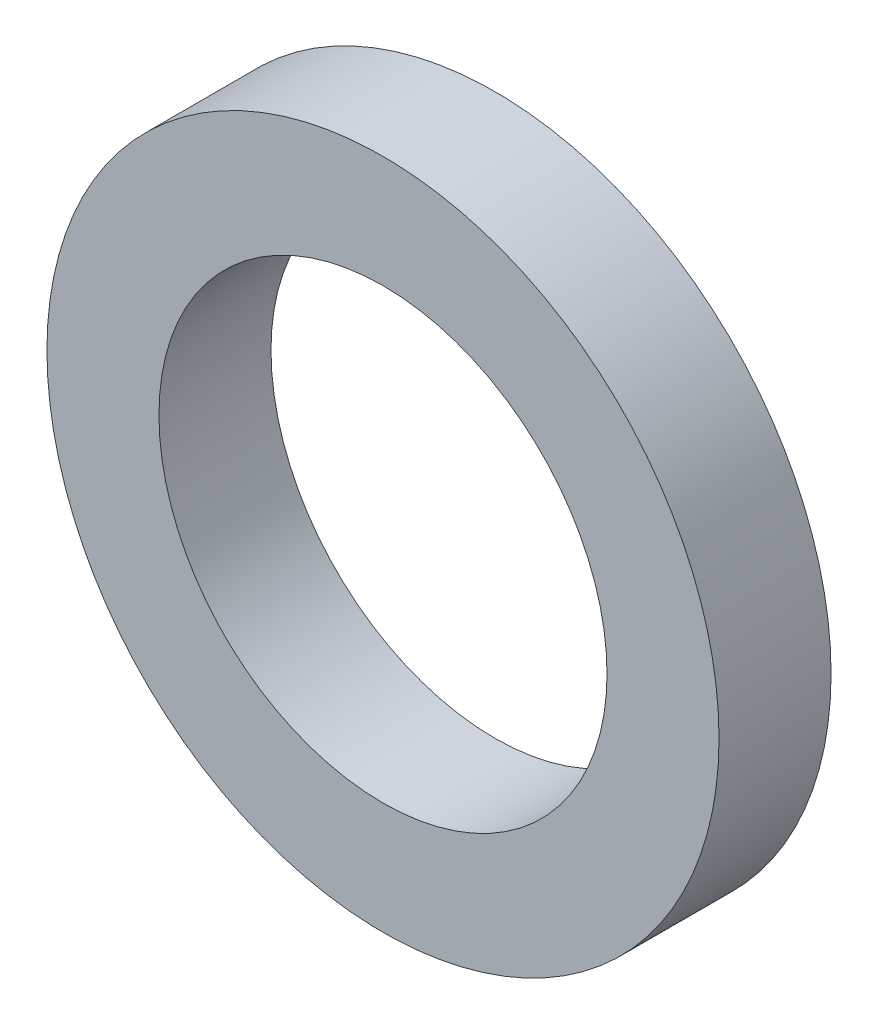
ISO-10303-21;
HEADER;
FILE_DESCRIPTION(('STEP AP214'),'2;1');
FILE_NAME('part.step','',(''),(''),'','','');
FILE_SCHEMA(('AUTOMOTIVE_DESIGN { 1 0 10303 214 1 1 1 1 }'));
ENDSEC;
DATA;
#1=APPLICATION_CONTEXT('core data for automotive mechanical design processes');
#2=APPLICATION_PROTOCOL_DEFINITION('international standard','automotive_design',2000,#1);
#3=PRODUCT_CONTEXT('',#1,'mechanical');
#4=PRODUCT('Part','Part','',(#3));
#5=PRODUCT_RELATED_PRODUCT_CATEGORY('part','',(#4));
#6=PRODUCT_DEFINITION_FORMATION('','',#4);
#7=PRODUCT_DEFINITION_CONTEXT('part definition',#1,'design');
#8=PRODUCT_DEFINITION('design','',#6,#7);
#9=PRODUCT_DEFINITION_SHAPE('','',#8);
#10=(LENGTH_UNIT() NAMED_UNIT(*) SI_UNIT(.MILLI.,.METRE.));
#11=(NAMED_UNIT(*) PLANE_ANGLE_UNIT() SI_UNIT($,.RADIAN.));
#12=(NAMED_UNIT(*) SI_UNIT($,.STERADIAN.) SOLID_ANGLE_UNIT());
#13=UNCERTAINTY_MEASURE_WITH_UNIT(LENGTH_MEASURE(1.E-05),#10,'distance_accuracy_value','');
#14=(GEOMETRIC_REPRESENTATION_CONTEXT(3) GLOBAL_UNCERTAINTY_ASSIGNED_CONTEXT((#13)) GLOBAL_UNIT_ASSIGNED_CONTEXT((#10,
#11,#12)) REPRESENTATION_CONTEXT('',''));
#15=CARTESIAN_POINT('',(0.,0.,0.));
#16=DIRECTION('',(0.,0.,1.));
#17=DIRECTION('',(1.,0.,0.));
#18=AXIS2_PLACEMENT_3D('',#15,#16,#17);
#19=CARTESIAN_POINT('',(0.,0.,150.));
#20=DIRECTION('',(0.,0.,1.));
#21=DIRECTION('',(1.,0.,0.));
#22=AXIS2_PLACEMENT_3D('',#19,#20,#21);
#23=CYLINDRICAL_SURFACE('',#22,14.);
#24=CARTESIAN_POINT('',(0.,0.,-97.));
#25=DIRECTION('',(0.,0.,1.));
#26=DIRECTION('',(1.,0.,0.));
#27=AXIS2_PLACEMENT_3D('',#24,#25,#26);
#28=CIRCLE('',#27,14.);
#29=CARTESIAN_POINT('',(14.,0.,-97.));
#30=VERTEX_POINT('',#29);
#31=EDGE_CURVE('E10',#30,#30,#28,.T.);
#32=ORIENTED_EDGE('',*,*,#31,.T.);
#33=EDGE_LOOP('',(#32));
#34=FACE_BOUND('',#33,.T.);
#35=CARTESIAN_POINT('',(0.,0.,-104.));
#36=DIRECTION('',(0.,0.,1.));
#37=DIRECTION('',(1.,0.,0.));
#38=AXIS2_PLACEMENT_3D('',#35,#36,#37);
#39=CIRCLE('',#38,14.);
#40=CARTESIAN_POINT('',(14.,0.,-104.));
#41=VERTEX_POINT('',#40);
#42=EDGE_CURVE('E59',#41,#41,#39,.T.);
#43=ORIENTED_EDGE('',*,*,#42,.F.);
#44=EDGE_LOOP('',(#43));
#45=FACE_BOUND('',#44,.T.);
#46=ADVANCED_FACE('F39',(#34,#45),#23,.F.);
#47=CARTESIAN_POINT('',(14.,0.,-97.));
#48=DIRECTION('',(0.,0.,1.));
#49=DIRECTION('',(1.,0.,0.));
#50=AXIS2_PLACEMENT_3D('',#47,#48,#49);
#51=PLANE('',#50);
#52=CARTESIAN_POINT('',(0.,0.,-97.));
#53=DIRECTION('',(0.,0.,1.));
#54=DIRECTION('',(1.,0.,0.));
#55=AXIS2_PLACEMENT_3D('',#52,#53,#54);
#56=CIRCLE('',#55,21.);
#57=CARTESIAN_POINT('',(21.,0.,-97.));
#58=VERTEX_POINT('',#57);
#59=EDGE_CURVE('E46',#58,#58,#56,.T.);
#60=ORIENTED_EDGE('',*,*,#59,.T.);
#61=EDGE_LOOP('',(#60));
#62=FACE_BOUND('',#61,.T.);
#63=ORIENTED_EDGE('',*,*,#31,.F.);
#64=EDGE_LOOP('',(#63));
#65=FACE_BOUND('',#64,.T.);
#66=ADVANCED_FACE('F68',(#62,#65),#51,.T.);
#67=CARTESIAN_POINT('',(0.,0.,150.));
#68=DIRECTION('',(0.,0.,1.));
#69=DIRECTION('',(1.,0.,0.));
#70=AXIS2_PLACEMENT_3D('',#67,#68,#69);
#71=CYLINDRICAL_SURFACE('',#70,21.);
#72=CARTESIAN_POINT('',(0.,0.,-104.));
#73=DIRECTION('',(0.,0.,1.));
#74=DIRECTION('',(1.,0.,0.));
#75=AXIS2_PLACEMENT_3D('',#72,#73,#74);
#76=CIRCLE('',#75,21.);
#77=CARTESIAN_POINT('',(21.,0.,-104.));
#78=VERTEX_POINT('',#77);
#79=EDGE_CURVE('E55',#78,#78,#76,.T.);
#80=ORIENTED_EDGE('',*,*,#79,.T.);
#81=EDGE_LOOP('',(#80));
#82=FACE_BOUND('',#81,.T.);
#83=ORIENTED_EDGE('',*,*,#59,.F.);
#84=EDGE_LOOP('',(#83));
#85=FACE_BOUND('',#84,.T.);
#86=ADVANCED_FACE('F74',(#82,#85),#71,.T.);
#87=CARTESIAN_POINT('',(21.,0.,-104.));
#88=DIRECTION('',(0.,0.,-1.));
#89=DIRECTION('',(-1.,0.,0.));
#90=AXIS2_PLACEMENT_3D('',#87,#88,#89);
#91=PLANE('',#90);
#92=ORIENTED_EDGE('',*,*,#42,.T.);
#93=EDGE_LOOP('',(#92));
#94=FACE_BOUND('',#93,.T.);
#95=ORIENTED_EDGE('',*,*,#79,.F.);
#96=EDGE_LOOP('',(#95));
#97=FACE_BOUND('',#96,.T.);
#98=ADVANCED_FACE('F67',(#94,#97),#91,.T.);
#99=CLOSED_SHELL('',(#46,#66,#86,#98));
#100=MANIFOLD_SOLID_BREP('B2',#99);
#101=ADVANCED_BREP_SHAPE_REPRESENTATION('',(#18,#100),#14);
#102=SHAPE_DEFINITION_REPRESENTATION(#9,#101);
ENDSEC;
END-ISO-10303-21;
